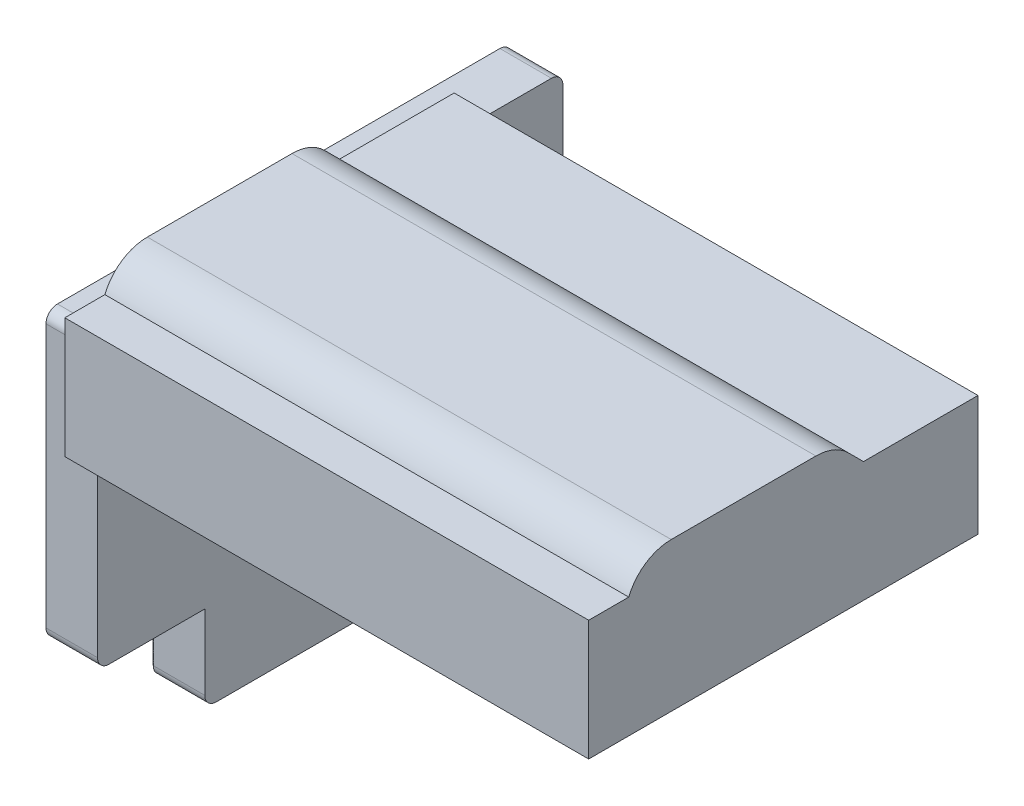
ISO-10303-21;
HEADER;
FILE_DESCRIPTION(('STEP AP214'),'2;1');
FILE_NAME('part.step','',(''),(''),'','','');
FILE_SCHEMA(('AUTOMOTIVE_DESIGN { 1 0 10303 214 1 1 1 1 }'));
ENDSEC;
DATA;
#1=APPLICATION_CONTEXT('core data for automotive mechanical design processes');
#2=APPLICATION_PROTOCOL_DEFINITION('international standard','automotive_design',2000,#1);
#3=PRODUCT_CONTEXT('',#1,'mechanical');
#4=PRODUCT('Part','Part','',(#3));
#5=PRODUCT_RELATED_PRODUCT_CATEGORY('part','',(#4));
#6=PRODUCT_DEFINITION_FORMATION('','',#4);
#7=PRODUCT_DEFINITION_CONTEXT('part definition',#1,'design');
#8=PRODUCT_DEFINITION('design','',#6,#7);
#9=PRODUCT_DEFINITION_SHAPE('','',#8);
#10=(LENGTH_UNIT() NAMED_UNIT(*) SI_UNIT(.MILLI.,.METRE.));
#11=(NAMED_UNIT(*) PLANE_ANGLE_UNIT() SI_UNIT($,.RADIAN.));
#12=(NAMED_UNIT(*) SI_UNIT($,.STERADIAN.) SOLID_ANGLE_UNIT());
#13=UNCERTAINTY_MEASURE_WITH_UNIT(LENGTH_MEASURE(1.E-05),#10,'distance_accuracy_value','');
#14=(GEOMETRIC_REPRESENTATION_CONTEXT(3) GLOBAL_UNCERTAINTY_ASSIGNED_CONTEXT((#13)) GLOBAL_UNIT_ASSIGNED_CONTEXT((#10,
#11,#12)) REPRESENTATION_CONTEXT('',''));
#15=CARTESIAN_POINT('',(0.,0.,0.));
#16=DIRECTION('',(0.,0.,1.));
#17=DIRECTION('',(1.,0.,0.));
#18=AXIS2_PLACEMENT_3D('',#15,#16,#17);
#19=CARTESIAN_POINT('',(-547.5,0.,-57.15));
#20=DIRECTION('',(0.,0.,1.));
#21=DIRECTION('',(1.,0.,0.));
#22=AXIS2_PLACEMENT_3D('',#19,#20,#21);
#23=PLANE('',#22);
#24=DIRECTION('',(0.,-1.,0.));
#25=VECTOR('',#24,1.);
#26=CARTESIAN_POINT('',(-457.5,0.,-57.15));
#27=LINE('',#26,#25);
#28=CARTESIAN_POINT('',(-457.5,-82.68,-57.15));
#29=VERTEX_POINT('',#28);
#30=CARTESIAN_POINT('',(-457.5,-542.68,-57.15));
#31=VERTEX_POINT('',#30);
#32=EDGE_CURVE('E190',#29,#31,#27,.T.);
#33=ORIENTED_EDGE('',*,*,#32,.F.);
#34=DIRECTION('',(1.,0.,0.));
#35=VECTOR('',#34,1.);
#36=CARTESIAN_POINT('',(-547.5,-82.68,-57.15));
#37=LINE('',#36,#35);
#38=CARTESIAN_POINT('',(-547.5,-82.68,-57.15));
#39=VERTEX_POINT('',#38);
#40=EDGE_CURVE('E228',#29,#39,#37,.F.);
#41=ORIENTED_EDGE('',*,*,#40,.T.);
#42=DIRECTION('',(0.,-1.,0.));
#43=VECTOR('',#42,1.);
#44=CARTESIAN_POINT('',(-547.5,0.,-57.15));
#45=LINE('',#44,#43);
#46=CARTESIAN_POINT('',(-547.5,-542.68,-57.15));
#47=VERTEX_POINT('',#46);
#48=EDGE_CURVE('E278',#39,#47,#45,.T.);
#49=ORIENTED_EDGE('',*,*,#48,.T.);
#50=DIRECTION('',(1.,0.,0.));
#51=VECTOR('',#50,1.);
#52=CARTESIAN_POINT('',(-547.5,-542.68,-57.15));
#53=LINE('',#52,#51);
#54=EDGE_CURVE('E225',#47,#31,#53,.T.);
#55=ORIENTED_EDGE('',*,*,#54,.T.);
#56=EDGE_LOOP('',(#33,#41,#49,#55));
#57=FACE_BOUND('',#56,.T.);
#58=ADVANCED_FACE('F44',(#57),#23,.T.);
#59=CARTESIAN_POINT('',(-547.5,-62.68,0.));
#60=DIRECTION('',(0.,-1.,0.));
#61=DIRECTION('',(0.,0.,-1.));
#62=AXIS2_PLACEMENT_3D('',#59,#60,#61);
#63=PLANE('',#62);
#64=DIRECTION('',(0.,0.,-1.));
#65=VECTOR('',#64,1.);
#66=CARTESIAN_POINT('',(-547.5,-62.68,0.));
#67=LINE('',#66,#65);
#68=CARTESIAN_POINT('',(-547.5,-62.68,-77.15));
#69=VERTEX_POINT('',#68);
#70=CARTESIAN_POINT('',(-547.5,-62.68,-849.95));
#71=VERTEX_POINT('',#70);
#72=EDGE_CURVE('E178',#69,#71,#67,.T.);
#73=ORIENTED_EDGE('',*,*,#72,.F.);
#74=DIRECTION('',(1.,0.,0.));
#75=VECTOR('',#74,1.);
#76=CARTESIAN_POINT('',(-457.5,-62.68,-77.15));
#77=LINE('',#76,#75);
#78=CARTESIAN_POINT('',(-457.5,-62.68,-77.15));
#79=VERTEX_POINT('',#78);
#80=EDGE_CURVE('E210',#69,#79,#77,.T.);
#81=ORIENTED_EDGE('',*,*,#80,.T.);
#82=DIRECTION('',(0.,0.,-1.));
#83=VECTOR('',#82,1.);
#84=CARTESIAN_POINT('',(-457.5,-62.68,0.));
#85=LINE('',#84,#83);
#86=CARTESIAN_POINT('',(-457.5,-62.68,-849.95));
#87=VERTEX_POINT('',#86);
#88=EDGE_CURVE('E193',#79,#87,#85,.T.);
#89=ORIENTED_EDGE('',*,*,#88,.T.);
#90=DIRECTION('',(1.,0.,0.));
#91=VECTOR('',#90,1.);
#92=CARTESIAN_POINT('',(-547.5,-62.68,-849.95));
#93=LINE('',#92,#91);
#94=EDGE_CURVE('E159',#87,#71,#93,.F.);
#95=ORIENTED_EDGE('',*,*,#94,.T.);
#96=EDGE_LOOP('',(#73,#81,#89,#95));
#97=FACE_BOUND('',#96,.T.);
#98=ADVANCED_FACE('F268',(#97),#63,.F.);
#99=CARTESIAN_POINT('',(-547.5,0.,-869.95));
#100=DIRECTION('',(0.,0.,1.));
#101=DIRECTION('',(1.,0.,0.));
#102=AXIS2_PLACEMENT_3D('',#99,#100,#101);
#103=PLANE('',#102);
#104=DIRECTION('',(0.,-1.,0.));
#105=VECTOR('',#104,1.);
#106=CARTESIAN_POINT('',(-457.5,0.,-869.95));
#107=LINE('',#106,#105);
#108=CARTESIAN_POINT('',(-457.5,-82.68,-869.95));
#109=VERTEX_POINT('',#108);
#110=CARTESIAN_POINT('',(-457.5,-542.68,-869.95));
#111=VERTEX_POINT('',#110);
#112=EDGE_CURVE('E196',#109,#111,#107,.T.);
#113=ORIENTED_EDGE('',*,*,#112,.T.);
#114=DIRECTION('',(1.,0.,0.));
#115=VECTOR('',#114,1.);
#116=CARTESIAN_POINT('',(-547.5,-542.68,-869.95));
#117=LINE('',#116,#115);
#118=CARTESIAN_POINT('',(-547.5,-542.68,-869.95));
#119=VERTEX_POINT('',#118);
#120=EDGE_CURVE('E12',#111,#119,#117,.F.);
#121=ORIENTED_EDGE('',*,*,#120,.T.);
#122=DIRECTION('',(0.,-1.,0.));
#123=VECTOR('',#122,1.);
#124=CARTESIAN_POINT('',(-547.5,0.,-869.95));
#125=LINE('',#124,#123);
#126=CARTESIAN_POINT('',(-547.5,-82.68,-869.95));
#127=VERTEX_POINT('',#126);
#128=EDGE_CURVE('E175',#127,#119,#125,.T.);
#129=ORIENTED_EDGE('',*,*,#128,.F.);
#130=DIRECTION('',(1.,0.,0.));
#131=VECTOR('',#130,1.);
#132=CARTESIAN_POINT('',(-547.5,-82.68,-869.95));
#133=LINE('',#132,#131);
#134=EDGE_CURVE('E52',#127,#109,#133,.T.);
#135=ORIENTED_EDGE('',*,*,#134,.T.);
#136=EDGE_LOOP('',(#113,#121,#129,#135));
#137=FACE_BOUND('',#136,.T.);
#138=ADVANCED_FACE('F255',(#137),#103,.F.);
#139=CARTESIAN_POINT('',(-547.5,-562.68,1.12410636858032E-13));
#140=DIRECTION('',(0.,-1.,0.));
#141=DIRECTION('',(0.,0.,-1.));
#142=AXIS2_PLACEMENT_3D('',#139,#140,#141);
#143=PLANE('',#142);
#144=DIRECTION('',(0.,0.,-1.));
#145=VECTOR('',#144,1.);
#146=CARTESIAN_POINT('',(-547.5,-562.68,1.12410636858032E-13));
#147=LINE('',#146,#145);
#148=CARTESIAN_POINT('',(-547.5,-562.68,-682.625));
#149=VERTEX_POINT('',#148);
#150=CARTESIAN_POINT('',(-547.5,-562.68,-849.95));
#151=VERTEX_POINT('',#150);
#152=EDGE_CURVE('E152',#149,#151,#147,.T.);
#153=ORIENTED_EDGE('',*,*,#152,.T.);
#154=DIRECTION('',(1.,0.,0.));
#155=VECTOR('',#154,1.);
#156=CARTESIAN_POINT('',(-457.5,-562.68,-849.95));
#157=LINE('',#156,#155);
#158=CARTESIAN_POINT('',(-457.5,-562.68,-849.95));
#159=VERTEX_POINT('',#158);
#160=EDGE_CURVE('E249',#151,#159,#157,.T.);
#161=ORIENTED_EDGE('',*,*,#160,.T.);
#162=DIRECTION('',(0.,0.,-1.));
#163=VECTOR('',#162,1.);
#164=CARTESIAN_POINT('',(-457.5,-562.68,1.05063572724483E-13));
#165=LINE('',#164,#163);
#166=CARTESIAN_POINT('',(-457.5,-562.68,-682.625));
#167=VERTEX_POINT('',#166);
#168=EDGE_CURVE('E155',#167,#159,#165,.T.);
#169=ORIENTED_EDGE('',*,*,#168,.F.);
#170=DIRECTION('',(1.,0.,0.));
#171=VECTOR('',#170,1.);
#172=CARTESIAN_POINT('',(-547.5,-562.68,-682.625));
#173=LINE('',#172,#171);
#174=EDGE_CURVE('E147',#149,#167,#173,.T.);
#175=ORIENTED_EDGE('',*,*,#174,.F.);
#176=EDGE_LOOP('',(#153,#161,#169,#175));
#177=FACE_BOUND('',#176,.T.);
#178=ADVANCED_FACE('F149',(#177),#143,.T.);
#179=CARTESIAN_POINT('',(-547.5,-5.02813728435726E-13,-682.625000000001));
#180=DIRECTION('',(0.,0.,1.));
#181=DIRECTION('',(0.,-1.,0.));
#182=AXIS2_PLACEMENT_3D('',#179,#180,#181);
#183=PLANE('',#182);
#184=DIRECTION('',(0.,-1.,0.));
#185=VECTOR('',#184,1.);
#186=CARTESIAN_POINT('',(-457.5,-5.02813728435726E-13,-682.625000000001));
#187=LINE('',#186,#185);
#188=CARTESIAN_POINT('',(-457.5,-693.405,-682.625));
#189=VERTEX_POINT('',#188);
#190=EDGE_CURVE('E200',#167,#189,#187,.T.);
#191=ORIENTED_EDGE('',*,*,#190,.T.);
#192=DIRECTION('',(1.,0.,0.));
#193=VECTOR('',#192,1.);
#194=CARTESIAN_POINT('',(-547.5,-693.405,-682.625));
#195=LINE('',#194,#193);
#196=CARTESIAN_POINT('',(-547.5,-693.405,-682.625));
#197=VERTEX_POINT('',#196);
#198=EDGE_CURVE('E166',#189,#197,#195,.F.);
#199=ORIENTED_EDGE('',*,*,#198,.T.);
#200=DIRECTION('',(0.,-1.,0.));
#201=VECTOR('',#200,1.);
#202=CARTESIAN_POINT('',(-547.5,-5.02813728435726E-13,-682.625000000001));
#203=LINE('',#202,#201);
#204=EDGE_CURVE('E163',#149,#197,#203,.T.);
#205=ORIENTED_EDGE('',*,*,#204,.F.);
#206=ORIENTED_EDGE('',*,*,#174,.T.);
#207=EDGE_LOOP('',(#191,#199,#205,#206));
#208=FACE_BOUND('',#207,.T.);
#209=ADVANCED_FACE('F164',(#208),#183,.F.);
#210=CARTESIAN_POINT('',(-547.5,-713.405,0.));
#211=DIRECTION('',(0.,1.,0.));
#212=DIRECTION('',(0.,0.,1.));
#213=AXIS2_PLACEMENT_3D('',#210,#211,#212);
#214=PLANE('',#213);
#215=DIRECTION('',(0.,0.,1.));
#216=VECTOR('',#215,1.);
#217=CARTESIAN_POINT('',(-457.5,-713.405,0.));
#218=LINE('',#217,#216);
#219=CARTESIAN_POINT('',(-457.5,-713.405,-662.625));
#220=VERTEX_POINT('',#219);
#221=CARTESIAN_POINT('',(-457.5,-713.405,-264.475));
#222=VERTEX_POINT('',#221);
#223=EDGE_CURVE('E203',#220,#222,#218,.T.);
#224=ORIENTED_EDGE('',*,*,#223,.T.);
#225=DIRECTION('',(1.,0.,0.));
#226=VECTOR('',#225,1.);
#227=CARTESIAN_POINT('',(-547.5,-713.405,-264.475));
#228=LINE('',#227,#226);
#229=CARTESIAN_POINT('',(-547.5,-713.405,-264.475));
#230=VERTEX_POINT('',#229);
#231=EDGE_CURVE('E246',#222,#230,#228,.F.);
#232=ORIENTED_EDGE('',*,*,#231,.T.);
#233=DIRECTION('',(0.,0.,1.));
#234=VECTOR('',#233,1.);
#235=CARTESIAN_POINT('',(-547.5,-713.405,0.));
#236=LINE('',#235,#234);
#237=CARTESIAN_POINT('',(-547.5,-713.405,-662.625));
#238=VERTEX_POINT('',#237);
#239=EDGE_CURVE('E168',#238,#230,#236,.T.);
#240=ORIENTED_EDGE('',*,*,#239,.F.);
#241=DIRECTION('',(1.,0.,0.));
#242=VECTOR('',#241,1.);
#243=CARTESIAN_POINT('',(-547.5,-713.405,-662.625));
#244=LINE('',#243,#242);
#245=EDGE_CURVE('E243',#238,#220,#244,.T.);
#246=ORIENTED_EDGE('',*,*,#245,.T.);
#247=EDGE_LOOP('',(#224,#232,#240,#246));
#248=FACE_BOUND('',#247,.T.);
#249=ADVANCED_FACE('F290',(#248),#214,.F.);
#250=CARTESIAN_POINT('',(-547.5,0.,-244.475));
#251=DIRECTION('',(0.,0.,1.));
#252=DIRECTION('',(0.,-1.,0.));
#253=AXIS2_PLACEMENT_3D('',#250,#251,#252);
#254=PLANE('',#253);
#255=DIRECTION('',(0.,-1.,0.));
#256=VECTOR('',#255,1.);
#257=CARTESIAN_POINT('',(-547.5,0.,-244.475));
#258=LINE('',#257,#256);
#259=CARTESIAN_POINT('',(-547.5,-562.68,-244.475));
#260=VERTEX_POINT('',#259);
#261=CARTESIAN_POINT('',(-547.5,-693.405,-244.475));
#262=VERTEX_POINT('',#261);
#263=EDGE_CURVE('E180',#260,#262,#258,.T.);
#264=ORIENTED_EDGE('',*,*,#263,.T.);
#265=DIRECTION('',(1.,0.,0.));
#266=VECTOR('',#265,1.);
#267=CARTESIAN_POINT('',(-457.5,-693.405,-244.475));
#268=LINE('',#267,#266);
#269=CARTESIAN_POINT('',(-457.5,-693.405,-244.475));
#270=VERTEX_POINT('',#269);
#271=EDGE_CURVE('E241',#262,#270,#268,.T.);
#272=ORIENTED_EDGE('',*,*,#271,.T.);
#273=DIRECTION('',(0.,-1.,0.));
#274=VECTOR('',#273,1.);
#275=CARTESIAN_POINT('',(-457.5,0.,-244.475));
#276=LINE('',#275,#274);
#277=CARTESIAN_POINT('',(-457.5,-562.68,-244.475));
#278=VERTEX_POINT('',#277);
#279=EDGE_CURVE('E206',#278,#270,#276,.T.);
#280=ORIENTED_EDGE('',*,*,#279,.F.);
#281=DIRECTION('',(1.,0.,0.));
#282=VECTOR('',#281,1.);
#283=CARTESIAN_POINT('',(-547.5,-562.68,-244.475));
#284=LINE('',#283,#282);
#285=EDGE_CURVE('E160',#260,#278,#284,.T.);
#286=ORIENTED_EDGE('',*,*,#285,.F.);
#287=EDGE_LOOP('',(#264,#272,#280,#286));
#288=FACE_BOUND('',#287,.T.);
#289=ADVANCED_FACE('F284',(#288),#254,.T.);
#290=CARTESIAN_POINT('',(-457.5,-562.68,-77.15));
#291=VERTEX_POINT('',#290);
#292=EDGE_CURVE('E201',#291,#278,#165,.T.);
#293=ORIENTED_EDGE('',*,*,#292,.F.);
#294=DIRECTION('',(1.,0.,0.));
#295=VECTOR('',#294,1.);
#296=CARTESIAN_POINT('',(-547.5,-562.68,-77.15));
#297=LINE('',#296,#295);
#298=CARTESIAN_POINT('',(-547.5,-562.68,-77.15));
#299=VERTEX_POINT('',#298);
#300=EDGE_CURVE('E59',#291,#299,#297,.F.);
#301=ORIENTED_EDGE('',*,*,#300,.T.);
#302=EDGE_CURVE('E177',#299,#260,#147,.T.);
#303=ORIENTED_EDGE('',*,*,#302,.T.);
#304=ORIENTED_EDGE('',*,*,#285,.T.);
#305=EDGE_LOOP('',(#293,#301,#303,#304));
#306=FACE_BOUND('',#305,.T.);
#307=ADVANCED_FACE('F283',(#306),#143,.T.);
#308=CARTESIAN_POINT('',(-547.5,0.,0.));
#309=DIRECTION('',(-1.,0.,0.));
#310=DIRECTION('',(0.,0.,1.));
#311=AXIS2_PLACEMENT_3D('',#308,#309,#310);
#312=PLANE('',#311);
#313=ORIENTED_EDGE('',*,*,#48,.F.);
#314=CARTESIAN_POINT('',(-547.5,-82.68,-77.15));
#315=DIRECTION('',(-1.,0.,0.));
#316=DIRECTION('',(0.,0.,1.));
#317=AXIS2_PLACEMENT_3D('',#314,#315,#316);
#318=CIRCLE('',#317,20.);
#319=EDGE_CURVE('E238',#39,#69,#318,.T.);
#320=ORIENTED_EDGE('',*,*,#319,.T.);
#321=ORIENTED_EDGE('',*,*,#72,.T.);
#322=CARTESIAN_POINT('',(-547.5,-82.68,-849.95));
#323=DIRECTION('',(-1.,0.,0.));
#324=DIRECTION('',(0.,0.,1.));
#325=AXIS2_PLACEMENT_3D('',#322,#323,#324);
#326=CIRCLE('',#325,20.);
#327=EDGE_CURVE('E230',#71,#127,#326,.T.);
#328=ORIENTED_EDGE('',*,*,#327,.T.);
#329=ORIENTED_EDGE('',*,*,#128,.T.);
#330=CARTESIAN_POINT('',(-547.5,-542.68,-849.95));
#331=DIRECTION('',(-1.,0.,0.));
#332=DIRECTION('',(0.,0.,1.));
#333=AXIS2_PLACEMENT_3D('',#330,#331,#332);
#334=CIRCLE('',#333,20.);
#335=EDGE_CURVE('E174',#119,#151,#334,.T.);
#336=ORIENTED_EDGE('',*,*,#335,.T.);
#337=ORIENTED_EDGE('',*,*,#152,.F.);
#338=ORIENTED_EDGE('',*,*,#204,.T.);
#339=CARTESIAN_POINT('',(-547.5,-693.405,-662.625));
#340=DIRECTION('',(-1.,0.,0.));
#341=DIRECTION('',(0.,0.,1.));
#342=AXIS2_PLACEMENT_3D('',#339,#340,#341);
#343=CIRCLE('',#342,20.);
#344=EDGE_CURVE('E233',#197,#238,#343,.T.);
#345=ORIENTED_EDGE('',*,*,#344,.T.);
#346=ORIENTED_EDGE('',*,*,#239,.T.);
#347=CARTESIAN_POINT('',(-547.5,-693.405,-264.475));
#348=DIRECTION('',(-1.,0.,0.));
#349=DIRECTION('',(0.,0.,1.));
#350=AXIS2_PLACEMENT_3D('',#347,#348,#349);
#351=CIRCLE('',#350,20.);
#352=EDGE_CURVE('E67',#230,#262,#351,.T.);
#353=ORIENTED_EDGE('',*,*,#352,.T.);
#354=ORIENTED_EDGE('',*,*,#263,.F.);
#355=ORIENTED_EDGE('',*,*,#302,.F.);
#356=CARTESIAN_POINT('',(-547.5,-542.68,-77.15));
#357=DIRECTION('',(-1.,0.,0.));
#358=DIRECTION('',(0.,0.,1.));
#359=AXIS2_PLACEMENT_3D('',#356,#357,#358);
#360=CIRCLE('',#359,20.);
#361=EDGE_CURVE('E236',#299,#47,#360,.T.);
#362=ORIENTED_EDGE('',*,*,#361,.T.);
#363=EDGE_LOOP('',(#313,#320,#321,#328,#329,#336,#337,#338,#345,#346,#353,#354,#355,#362));
#364=FACE_BOUND('',#363,.T.);
#365=ADVANCED_FACE('F171',(#364),#312,.T.);
#366=CARTESIAN_POINT('',(-457.5,0.,0.));
#367=DIRECTION('',(-1.,0.,0.));
#368=DIRECTION('',(0.,0.,1.));
#369=AXIS2_PLACEMENT_3D('',#366,#367,#368);
#370=PLANE('',#369);
#371=ORIENTED_EDGE('',*,*,#88,.F.);
#372=CARTESIAN_POINT('',(-457.5,-82.68,-77.15));
#373=DIRECTION('',(-1.,0.,0.));
#374=DIRECTION('',(0.,0.,1.));
#375=AXIS2_PLACEMENT_3D('',#372,#373,#374);
#376=CIRCLE('',#375,20.);
#377=EDGE_CURVE('E223',#79,#29,#376,.F.);
#378=ORIENTED_EDGE('',*,*,#377,.T.);
#379=ORIENTED_EDGE('',*,*,#32,.T.);
#380=CARTESIAN_POINT('',(-457.5,-542.68,-77.15));
#381=DIRECTION('',(-1.,0.,0.));
#382=DIRECTION('',(0.,0.,1.));
#383=AXIS2_PLACEMENT_3D('',#380,#381,#382);
#384=CIRCLE('',#383,20.);
#385=EDGE_CURVE('E221',#31,#291,#384,.F.);
#386=ORIENTED_EDGE('',*,*,#385,.T.);
#387=ORIENTED_EDGE('',*,*,#292,.T.);
#388=ORIENTED_EDGE('',*,*,#279,.T.);
#389=CARTESIAN_POINT('',(-457.5,-693.405,-264.475));
#390=DIRECTION('',(-1.,0.,0.));
#391=DIRECTION('',(0.,0.,1.));
#392=AXIS2_PLACEMENT_3D('',#389,#390,#391);
#393=CIRCLE('',#392,20.);
#394=EDGE_CURVE('E219',#270,#222,#393,.F.);
#395=ORIENTED_EDGE('',*,*,#394,.T.);
#396=ORIENTED_EDGE('',*,*,#223,.F.);
#397=CARTESIAN_POINT('',(-457.5,-693.405,-662.625));
#398=DIRECTION('',(-1.,0.,0.));
#399=DIRECTION('',(0.,0.,1.));
#400=AXIS2_PLACEMENT_3D('',#397,#398,#399);
#401=CIRCLE('',#400,20.);
#402=EDGE_CURVE('E217',#220,#189,#401,.F.);
#403=ORIENTED_EDGE('',*,*,#402,.T.);
#404=ORIENTED_EDGE('',*,*,#190,.F.);
#405=ORIENTED_EDGE('',*,*,#168,.T.);
#406=CARTESIAN_POINT('',(-457.5,-542.68,-849.95));
#407=DIRECTION('',(-1.,0.,0.));
#408=DIRECTION('',(0.,0.,1.));
#409=AXIS2_PLACEMENT_3D('',#406,#407,#408);
#410=CIRCLE('',#409,20.);
#411=EDGE_CURVE('E215',#159,#111,#410,.F.);
#412=ORIENTED_EDGE('',*,*,#411,.T.);
#413=ORIENTED_EDGE('',*,*,#112,.F.);
#414=CARTESIAN_POINT('',(-457.5,-82.68,-849.95));
#415=DIRECTION('',(-1.,0.,0.));
#416=DIRECTION('',(0.,0.,1.));
#417=AXIS2_PLACEMENT_3D('',#414,#415,#416);
#418=CIRCLE('',#417,20.);
#419=EDGE_CURVE('E213',#109,#87,#418,.F.);
#420=ORIENTED_EDGE('',*,*,#419,.T.);
#421=EDGE_LOOP('',(#371,#378,#379,#386,#387,#388,#395,#396,#403,#404,#405,#412,#413,#420));
#422=FACE_BOUND('',#421,.T.);
#423=ADVANCED_FACE('F261',(#422),#370,.F.);
#424=CARTESIAN_POINT('',(-547.5,-82.68,-77.15));
#425=DIRECTION('',(-1.,0.,0.));
#426=DIRECTION('',(0.,0.,1.));
#427=AXIS2_PLACEMENT_3D('',#424,#425,#426);
#428=CYLINDRICAL_SURFACE('',#427,20.);
#429=ORIENTED_EDGE('',*,*,#319,.F.);
#430=ORIENTED_EDGE('',*,*,#40,.F.);
#431=ORIENTED_EDGE('',*,*,#377,.F.);
#432=ORIENTED_EDGE('',*,*,#80,.F.);
#433=EDGE_LOOP('',(#429,#430,#431,#432));
#434=FACE_BOUND('',#433,.T.);
#435=ADVANCED_FACE('F277',(#434),#428,.T.);
#436=CARTESIAN_POINT('',(-547.5,-542.68,-77.15));
#437=DIRECTION('',(1.,0.,0.));
#438=DIRECTION('',(0.,0.,-1.));
#439=AXIS2_PLACEMENT_3D('',#436,#437,#438);
#440=CYLINDRICAL_SURFACE('',#439,20.);
#441=ORIENTED_EDGE('',*,*,#361,.F.);
#442=ORIENTED_EDGE('',*,*,#300,.F.);
#443=ORIENTED_EDGE('',*,*,#385,.F.);
#444=ORIENTED_EDGE('',*,*,#54,.F.);
#445=EDGE_LOOP('',(#441,#442,#443,#444));
#446=FACE_BOUND('',#445,.T.);
#447=ADVANCED_FACE('F301',(#446),#440,.T.);
#448=CARTESIAN_POINT('',(-547.5,-693.405,-264.475));
#449=DIRECTION('',(-1.,0.,0.));
#450=DIRECTION('',(0.,0.,1.));
#451=AXIS2_PLACEMENT_3D('',#448,#449,#450);
#452=CYLINDRICAL_SURFACE('',#451,20.);
#453=ORIENTED_EDGE('',*,*,#352,.F.);
#454=ORIENTED_EDGE('',*,*,#231,.F.);
#455=ORIENTED_EDGE('',*,*,#394,.F.);
#456=ORIENTED_EDGE('',*,*,#271,.F.);
#457=EDGE_LOOP('',(#453,#454,#455,#456));
#458=FACE_BOUND('',#457,.T.);
#459=ADVANCED_FACE('F286',(#458),#452,.T.);
#460=CARTESIAN_POINT('',(-547.5,-693.405,-662.625));
#461=DIRECTION('',(1.,0.,0.));
#462=DIRECTION('',(0.,0.,-1.));
#463=AXIS2_PLACEMENT_3D('',#460,#461,#462);
#464=CYLINDRICAL_SURFACE('',#463,20.);
#465=ORIENTED_EDGE('',*,*,#344,.F.);
#466=ORIENTED_EDGE('',*,*,#198,.F.);
#467=ORIENTED_EDGE('',*,*,#402,.F.);
#468=ORIENTED_EDGE('',*,*,#245,.F.);
#469=EDGE_LOOP('',(#465,#466,#467,#468));
#470=FACE_BOUND('',#469,.T.);
#471=ADVANCED_FACE('F294',(#470),#464,.T.);
#472=CARTESIAN_POINT('',(-547.5,-542.68,-849.95));
#473=DIRECTION('',(-1.,0.,0.));
#474=DIRECTION('',(0.,0.,1.));
#475=AXIS2_PLACEMENT_3D('',#472,#473,#474);
#476=CYLINDRICAL_SURFACE('',#475,20.);
#477=ORIENTED_EDGE('',*,*,#335,.F.);
#478=ORIENTED_EDGE('',*,*,#120,.F.);
#479=ORIENTED_EDGE('',*,*,#411,.F.);
#480=ORIENTED_EDGE('',*,*,#160,.F.);
#481=EDGE_LOOP('',(#477,#478,#479,#480));
#482=FACE_BOUND('',#481,.T.);
#483=ADVANCED_FACE('F263',(#482),#476,.T.);
#484=CARTESIAN_POINT('',(-547.5,-82.68,-849.95));
#485=DIRECTION('',(1.,0.,0.));
#486=DIRECTION('',(0.,0.,-1.));
#487=AXIS2_PLACEMENT_3D('',#484,#485,#486);
#488=CYLINDRICAL_SURFACE('',#487,20.);
#489=ORIENTED_EDGE('',*,*,#327,.F.);
#490=ORIENTED_EDGE('',*,*,#94,.F.);
#491=ORIENTED_EDGE('',*,*,#419,.F.);
#492=ORIENTED_EDGE('',*,*,#134,.F.);
#493=EDGE_LOOP('',(#489,#490,#491,#492));
#494=FACE_BOUND('',#493,.T.);
#495=ADVANCED_FACE('F46',(#494),#488,.T.);
#496=CLOSED_SHELL('',(#58,#98,#138,#178,#209,#249,#289,#307,#365,#423,#435,#447,#459,#471,#483,#495));
#497=MANIFOLD_SOLID_BREP('B2',#496);
#498=CARTESIAN_POINT('',(0.,0.,0.));
#499=DIRECTION('',(0.,1.,0.));
#500=DIRECTION('',(0.,0.,1.));
#501=AXIS2_PLACEMENT_3D('',#498,#499,#500);
#502=PLANE('',#501);
#503=DIRECTION('',(0.,0.,-1.));
#504=VECTOR('',#503,1.);
#505=CARTESIAN_POINT('',(457.5,0.,-680.));
#506=LINE('',#505,#504);
#507=CARTESIAN_POINT('',(457.5,0.,0.));
#508=VERTEX_POINT('',#507);
#509=CARTESIAN_POINT('',(457.5,0.,-70.));
#510=VERTEX_POINT('',#509);
#511=EDGE_CURVE('E581',#508,#510,#506,.T.);
#512=ORIENTED_EDGE('',*,*,#511,.T.);
#513=DIRECTION('',(-1.,0.,0.));
#514=VECTOR('',#513,1.);
#515=CARTESIAN_POINT('',(870.537528561268,0.,-69.9999999999999));
#516=LINE('',#515,#514);
#517=CARTESIAN_POINT('',(-457.5,0.,-70.));
#518=VERTEX_POINT('',#517);
#519=EDGE_CURVE('E535',#510,#518,#516,.T.);
#520=ORIENTED_EDGE('',*,*,#519,.T.);
#521=DIRECTION('',(0.,0.,1.));
#522=VECTOR('',#521,1.);
#523=CARTESIAN_POINT('',(-457.5,0.,-680.));
#524=LINE('',#523,#522);
#525=CARTESIAN_POINT('',(-457.5,0.,0.));
#526=VERTEX_POINT('',#525);
#527=EDGE_CURVE('E532',#518,#526,#524,.T.);
#528=ORIENTED_EDGE('',*,*,#527,.T.);
#529=DIRECTION('',(1.,0.,0.));
#530=VECTOR('',#529,1.);
#531=CARTESIAN_POINT('',(-457.5,0.,0.));
#532=LINE('',#531,#530);
#533=EDGE_CURVE('E531',#526,#508,#532,.T.);
#534=ORIENTED_EDGE('',*,*,#533,.T.);
#535=EDGE_LOOP('',(#512,#520,#528,#534));
#536=FACE_BOUND('',#535,.T.);
#537=ADVANCED_FACE('F442',(#536),#502,.T.);
#538=CARTESIAN_POINT('',(-457.5,-210.,-680.));
#539=DIRECTION('',(-1.,0.,0.));
#540=DIRECTION('',(0.,0.,1.));
#541=AXIS2_PLACEMENT_3D('',#538,#539,#540);
#542=PLANE('',#541);
#543=ORIENTED_EDGE('',*,*,#527,.F.);
#544=CARTESIAN_POINT('',(-457.5,-30.,-144.161984870957));
#545=DIRECTION('',(-1.,0.,0.));
#546=DIRECTION('',(0.,0.,1.));
#547=AXIS2_PLACEMENT_3D('',#544,#545,#546);
#548=CIRCLE('',#547,80.);
#549=CARTESIAN_POINT('',(-457.5,50.,-144.161984870957));
#550=VERTEX_POINT('',#549);
#551=EDGE_CURVE('E607',#518,#550,#548,.T.);
#552=ORIENTED_EDGE('',*,*,#551,.T.);
#553=DIRECTION('',(0.,0.,-1.));
#554=VECTOR('',#553,1.);
#555=CARTESIAN_POINT('',(-457.5,50.,0.));
#556=LINE('',#555,#554);
#557=CARTESIAN_POINT('',(-457.5,50.,-396.862915010152));
#558=VERTEX_POINT('',#557);
#559=EDGE_CURVE('E522',#550,#558,#556,.T.);
#560=ORIENTED_EDGE('',*,*,#559,.T.);
#561=CARTESIAN_POINT('',(-457.5,-30.,-396.862915010152));
#562=DIRECTION('',(-1.,0.,0.));
#563=DIRECTION('',(0.,0.,1.));
#564=AXIS2_PLACEMENT_3D('',#561,#562,#563);
#565=CIRCLE('',#564,80.);
#566=CARTESIAN_POINT('',(-457.5,26.5685424949238,-453.431457505076));
#567=VERTEX_POINT('',#566);
#568=EDGE_CURVE('E519',#558,#567,#565,.T.);
#569=ORIENTED_EDGE('',*,*,#568,.T.);
#570=DIRECTION('',(0.,-0.707106781186547,-0.707106781186548));
#571=VECTOR('',#570,1.);
#572=CARTESIAN_POINT('',(-457.5,240.,-240.));
#573=LINE('',#572,#571);
#574=CARTESIAN_POINT('',(-457.5,0.,-480.));
#575=VERTEX_POINT('',#574);
#576=EDGE_CURVE('E512',#567,#575,#573,.T.);
#577=ORIENTED_EDGE('',*,*,#576,.T.);
#578=CARTESIAN_POINT('',(-457.5,0.,-680.));
#579=VERTEX_POINT('',#578);
#580=EDGE_CURVE('E516',#579,#575,#524,.T.);
#581=ORIENTED_EDGE('',*,*,#580,.F.);
#582=DIRECTION('',(0.,1.,0.));
#583=VECTOR('',#582,1.);
#584=CARTESIAN_POINT('',(-457.5,-210.,-680.));
#585=LINE('',#584,#583);
#586=CARTESIAN_POINT('',(-457.5,-210.,-680.));
#587=VERTEX_POINT('',#586);
#588=EDGE_CURVE('E579',#587,#579,#585,.T.);
#589=ORIENTED_EDGE('',*,*,#588,.F.);
#590=DIRECTION('',(0.,0.,1.));
#591=VECTOR('',#590,1.);
#592=CARTESIAN_POINT('',(-457.5,-210.,-680.));
#593=LINE('',#592,#591);
#594=CARTESIAN_POINT('',(-457.5,-210.,0.));
#595=VERTEX_POINT('',#594);
#596=EDGE_CURVE('E554',#587,#595,#593,.T.);
#597=ORIENTED_EDGE('',*,*,#596,.T.);
#598=DIRECTION('',(0.,1.,0.));
#599=VECTOR('',#598,1.);
#600=CARTESIAN_POINT('',(-457.5,-210.,0.));
#601=LINE('',#600,#599);
#602=EDGE_CURVE('E566',#595,#526,#601,.T.);
#603=ORIENTED_EDGE('',*,*,#602,.T.);
#604=EDGE_LOOP('',(#543,#552,#560,#569,#577,#581,#589,#597,#603));
#605=FACE_BOUND('',#604,.T.);
#606=ADVANCED_FACE('F515',(#605),#542,.T.);
#607=CARTESIAN_POINT('',(-457.5,-210.,-680.));
#608=DIRECTION('',(0.,0.,-1.));
#609=DIRECTION('',(-1.,0.,0.));
#610=AXIS2_PLACEMENT_3D('',#607,#608,#609);
#611=PLANE('',#610);
#612=DIRECTION('',(-1.,0.,0.));
#613=VECTOR('',#612,1.);
#614=CARTESIAN_POINT('',(-457.5,0.,-680.));
#615=LINE('',#614,#613);
#616=CARTESIAN_POINT('',(457.5,0.,-680.));
#617=VERTEX_POINT('',#616);
#618=EDGE_CURVE('E530',#617,#579,#615,.T.);
#619=ORIENTED_EDGE('',*,*,#618,.F.);
#620=DIRECTION('',(0.,1.,0.));
#621=VECTOR('',#620,1.);
#622=CARTESIAN_POINT('',(457.5,-210.,-680.));
#623=LINE('',#622,#621);
#624=CARTESIAN_POINT('',(457.5,-210.,-680.));
#625=VERTEX_POINT('',#624);
#626=EDGE_CURVE('E576',#625,#617,#623,.T.);
#627=ORIENTED_EDGE('',*,*,#626,.F.);
#628=DIRECTION('',(-1.,0.,0.));
#629=VECTOR('',#628,1.);
#630=CARTESIAN_POINT('',(-457.5,-210.,-680.));
#631=LINE('',#630,#629);
#632=EDGE_CURVE('E563',#625,#587,#631,.T.);
#633=ORIENTED_EDGE('',*,*,#632,.T.);
#634=ORIENTED_EDGE('',*,*,#588,.T.);
#635=EDGE_LOOP('',(#619,#627,#633,#634));
#636=FACE_BOUND('',#635,.T.);
#637=ADVANCED_FACE('F623',(#636),#611,.T.);
#638=CARTESIAN_POINT('',(457.5,-210.,-680.));
#639=DIRECTION('',(1.,0.,0.));
#640=DIRECTION('',(0.,0.,-1.));
#641=AXIS2_PLACEMENT_3D('',#638,#639,#640);
#642=PLANE('',#641);
#643=DIRECTION('',(0.,0.,-1.));
#644=VECTOR('',#643,1.);
#645=CARTESIAN_POINT('',(457.5,50.,1.7867394491155E-13));
#646=LINE('',#645,#644);
#647=CARTESIAN_POINT('',(457.5,50.,-144.161984870957));
#648=VERTEX_POINT('',#647);
#649=CARTESIAN_POINT('',(457.5,50.,-396.862915010152));
#650=VERTEX_POINT('',#649);
#651=EDGE_CURVE('E538',#648,#650,#646,.T.);
#652=ORIENTED_EDGE('',*,*,#651,.F.);
#653=CARTESIAN_POINT('',(457.5,-30.,-144.161984870957));
#654=DIRECTION('',(1.,0.,0.));
#655=DIRECTION('',(0.,0.,-1.));
#656=AXIS2_PLACEMENT_3D('',#653,#654,#655);
#657=CIRCLE('',#656,80.);
#658=EDGE_CURVE('E450',#648,#510,#657,.T.);
#659=ORIENTED_EDGE('',*,*,#658,.T.);
#660=ORIENTED_EDGE('',*,*,#511,.F.);
#661=DIRECTION('',(0.,1.,0.));
#662=VECTOR('',#661,1.);
#663=CARTESIAN_POINT('',(457.5,-210.,0.));
#664=LINE('',#663,#662);
#665=CARTESIAN_POINT('',(457.5,-210.,0.));
#666=VERTEX_POINT('',#665);
#667=EDGE_CURVE('E574',#666,#508,#664,.T.);
#668=ORIENTED_EDGE('',*,*,#667,.F.);
#669=DIRECTION('',(0.,0.,-1.));
#670=VECTOR('',#669,1.);
#671=CARTESIAN_POINT('',(457.5,-210.,-680.));
#672=LINE('',#671,#670);
#673=EDGE_CURVE('E560',#666,#625,#672,.T.);
#674=ORIENTED_EDGE('',*,*,#673,.T.);
#675=ORIENTED_EDGE('',*,*,#626,.T.);
#676=CARTESIAN_POINT('',(457.5,0.,-480.));
#677=VERTEX_POINT('',#676);
#678=EDGE_CURVE('E544',#677,#617,#506,.T.);
#679=ORIENTED_EDGE('',*,*,#678,.F.);
#680=DIRECTION('',(0.,-0.707106781186547,-0.707106781186548));
#681=VECTOR('',#680,1.);
#682=CARTESIAN_POINT('',(457.5,240.,-240.));
#683=LINE('',#682,#681);
#684=CARTESIAN_POINT('',(457.5,26.5685424949238,-453.431457505076));
#685=VERTEX_POINT('',#684);
#686=EDGE_CURVE('E521',#685,#677,#683,.T.);
#687=ORIENTED_EDGE('',*,*,#686,.F.);
#688=CARTESIAN_POINT('',(457.5,-30.,-396.862915010152));
#689=DIRECTION('',(1.,0.,0.));
#690=DIRECTION('',(0.,0.,-1.));
#691=AXIS2_PLACEMENT_3D('',#688,#689,#690);
#692=CIRCLE('',#691,80.);
#693=EDGE_CURVE('E462',#685,#650,#692,.T.);
#694=ORIENTED_EDGE('',*,*,#693,.T.);
#695=EDGE_LOOP('',(#652,#659,#660,#668,#674,#675,#679,#687,#694));
#696=FACE_BOUND('',#695,.T.);
#697=ADVANCED_FACE('F594',(#696),#642,.T.);
#698=CARTESIAN_POINT('',(-457.5,-210.,0.));
#699=DIRECTION('',(0.,0.,1.));
#700=DIRECTION('',(1.,0.,0.));
#701=AXIS2_PLACEMENT_3D('',#698,#699,#700);
#702=PLANE('',#701);
#703=ORIENTED_EDGE('',*,*,#533,.F.);
#704=ORIENTED_EDGE('',*,*,#602,.F.);
#705=DIRECTION('',(1.,0.,0.));
#706=VECTOR('',#705,1.);
#707=CARTESIAN_POINT('',(-457.5,-210.,0.));
#708=LINE('',#707,#706);
#709=EDGE_CURVE('E557',#595,#666,#708,.T.);
#710=ORIENTED_EDGE('',*,*,#709,.T.);
#711=ORIENTED_EDGE('',*,*,#667,.T.);
#712=EDGE_LOOP('',(#703,#704,#710,#711));
#713=FACE_BOUND('',#712,.T.);
#714=ADVANCED_FACE('F591',(#713),#702,.T.);
#715=CARTESIAN_POINT('',(0.,-210.,0.));
#716=DIRECTION('',(0.,1.,0.));
#717=DIRECTION('',(0.,0.,1.));
#718=AXIS2_PLACEMENT_3D('',#715,#716,#717);
#719=PLANE('',#718);
#720=ORIENTED_EDGE('',*,*,#596,.F.);
#721=ORIENTED_EDGE('',*,*,#632,.F.);
#722=ORIENTED_EDGE('',*,*,#673,.F.);
#723=ORIENTED_EDGE('',*,*,#709,.F.);
#724=EDGE_LOOP('',(#720,#721,#722,#723));
#725=FACE_BOUND('',#724,.T.);
#726=ADVANCED_FACE('F621',(#725),#719,.F.);
#727=DIRECTION('',(-1.,0.,0.));
#728=VECTOR('',#727,1.);
#729=CARTESIAN_POINT('',(870.537528561268,0.,-480.));
#730=LINE('',#729,#728);
#731=EDGE_CURVE('E527',#677,#575,#730,.T.);
#732=ORIENTED_EDGE('',*,*,#731,.F.);
#733=ORIENTED_EDGE('',*,*,#678,.T.);
#734=ORIENTED_EDGE('',*,*,#618,.T.);
#735=ORIENTED_EDGE('',*,*,#580,.T.);
#736=EDGE_LOOP('',(#732,#733,#734,#735));
#737=FACE_BOUND('',#736,.T.);
#738=ADVANCED_FACE('F526',(#737),#502,.T.);
#739=CARTESIAN_POINT('',(870.537528561268,240.,-240.));
#740=DIRECTION('',(0.,0.707106781186548,-0.707106781186547));
#741=DIRECTION('',(0.,0.707106781186547,0.707106781186548));
#742=AXIS2_PLACEMENT_3D('',#739,#740,#741);
#743=PLANE('',#742);
#744=ORIENTED_EDGE('',*,*,#576,.F.);
#745=DIRECTION('',(-1.,0.,0.));
#746=VECTOR('',#745,1.);
#747=CARTESIAN_POINT('',(870.537528561268,26.5685424949238,-453.431457505076));
#748=LINE('',#747,#746);
#749=EDGE_CURVE('E42',#567,#685,#748,.F.);
#750=ORIENTED_EDGE('',*,*,#749,.T.);
#751=ORIENTED_EDGE('',*,*,#686,.T.);
#752=ORIENTED_EDGE('',*,*,#731,.T.);
#753=EDGE_LOOP('',(#744,#750,#751,#752));
#754=FACE_BOUND('',#753,.T.);
#755=ADVANCED_FACE('F534',(#754),#743,.T.);
#756=CARTESIAN_POINT('',(870.537528561268,50.,0.));
#757=DIRECTION('',(0.,1.,0.));
#758=DIRECTION('',(0.,0.,1.));
#759=AXIS2_PLACEMENT_3D('',#756,#757,#758);
#760=PLANE('',#759);
#761=ORIENTED_EDGE('',*,*,#559,.F.);
#762=DIRECTION('',(1.,0.,0.));
#763=VECTOR('',#762,1.);
#764=CARTESIAN_POINT('',(457.5,50.,-144.161984870957));
#765=LINE('',#764,#763);
#766=EDGE_CURVE('E599',#550,#648,#765,.T.);
#767=ORIENTED_EDGE('',*,*,#766,.T.);
#768=ORIENTED_EDGE('',*,*,#651,.T.);
#769=DIRECTION('',(-1.,0.,0.));
#770=VECTOR('',#769,1.);
#771=CARTESIAN_POINT('',(870.537528561268,50.,-396.862915010152));
#772=LINE('',#771,#770);
#773=EDGE_CURVE('E609',#650,#558,#772,.T.);
#774=ORIENTED_EDGE('',*,*,#773,.T.);
#775=EDGE_LOOP('',(#761,#767,#768,#774));
#776=FACE_BOUND('',#775,.T.);
#777=ADVANCED_FACE('F615',(#776),#760,.T.);
#778=CARTESIAN_POINT('',(870.537528561268,-30.,-144.161984870957));
#779=DIRECTION('',(-1.,0.,0.));
#780=DIRECTION('',(0.,0.,1.));
#781=AXIS2_PLACEMENT_3D('',#778,#779,#780);
#782=CYLINDRICAL_SURFACE('',#781,80.);
#783=ORIENTED_EDGE('',*,*,#658,.F.);
#784=ORIENTED_EDGE('',*,*,#766,.F.);
#785=ORIENTED_EDGE('',*,*,#551,.F.);
#786=ORIENTED_EDGE('',*,*,#519,.F.);
#787=EDGE_LOOP('',(#783,#784,#785,#786));
#788=FACE_BOUND('',#787,.T.);
#789=ADVANCED_FACE('F616',(#788),#782,.T.);
#790=CARTESIAN_POINT('',(870.537528561268,-30.,-396.862915010152));
#791=DIRECTION('',(-1.,0.,0.));
#792=DIRECTION('',(0.,0.,1.));
#793=AXIS2_PLACEMENT_3D('',#790,#791,#792);
#794=CYLINDRICAL_SURFACE('',#793,80.);
#795=ORIENTED_EDGE('',*,*,#693,.F.);
#796=ORIENTED_EDGE('',*,*,#749,.F.);
#797=ORIENTED_EDGE('',*,*,#568,.F.);
#798=ORIENTED_EDGE('',*,*,#773,.F.);
#799=EDGE_LOOP('',(#795,#796,#797,#798));
#800=FACE_BOUND('',#799,.T.);
#801=ADVANCED_FACE('F444',(#800),#794,.T.);
#802=CLOSED_SHELL('',(#537,#606,#637,#697,#714,#726,#738,#755,#777,#789,#801));
#803=MANIFOLD_SOLID_BREP('B6',#802);
#804=ADVANCED_BREP_SHAPE_REPRESENTATION('',(#18,#497,#803),#14);
#805=SHAPE_DEFINITION_REPRESENTATION(#9,#804);
ENDSEC;
END-ISO-10303-21;
